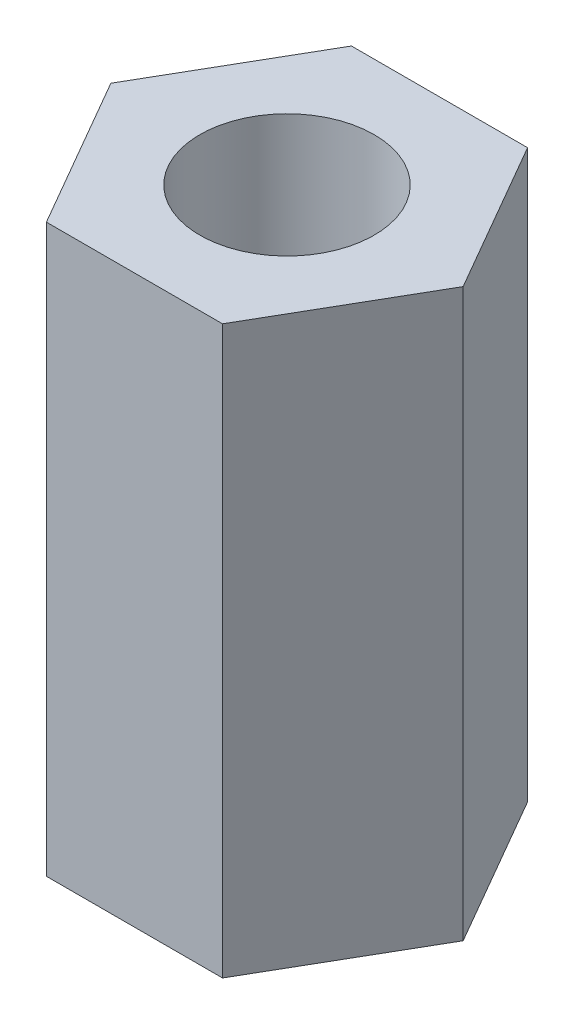
ISO-10303-21;
HEADER;
FILE_DESCRIPTION(('STEP AP214'),'2;1');
FILE_NAME('part.step','',(''),(''),'','','');
FILE_SCHEMA(('AUTOMOTIVE_DESIGN { 1 0 10303 214 1 1 1 1 }'));
ENDSEC;
DATA;
#1=APPLICATION_CONTEXT('core data for automotive mechanical design processes');
#2=APPLICATION_PROTOCOL_DEFINITION('international standard','automotive_design',2000,#1);
#3=PRODUCT_CONTEXT('',#1,'mechanical');
#4=PRODUCT('Part','Part','',(#3));
#5=PRODUCT_RELATED_PRODUCT_CATEGORY('part','',(#4));
#6=PRODUCT_DEFINITION_FORMATION('','',#4);
#7=PRODUCT_DEFINITION_CONTEXT('part definition',#1,'design');
#8=PRODUCT_DEFINITION('design','',#6,#7);
#9=PRODUCT_DEFINITION_SHAPE('','',#8);
#10=(LENGTH_UNIT() NAMED_UNIT(*) SI_UNIT(.MILLI.,.METRE.));
#11=(NAMED_UNIT(*) PLANE_ANGLE_UNIT() SI_UNIT($,.RADIAN.));
#12=(NAMED_UNIT(*) SI_UNIT($,.STERADIAN.) SOLID_ANGLE_UNIT());
#13=UNCERTAINTY_MEASURE_WITH_UNIT(LENGTH_MEASURE(1.E-05),#10,'distance_accuracy_value','');
#14=(GEOMETRIC_REPRESENTATION_CONTEXT(3) GLOBAL_UNCERTAINTY_ASSIGNED_CONTEXT((#13)) GLOBAL_UNIT_ASSIGNED_CONTEXT((#10,
#11,#12)) REPRESENTATION_CONTEXT('',''));
#15=CARTESIAN_POINT('',(0.,0.,0.));
#16=DIRECTION('',(0.,0.,1.));
#17=DIRECTION('',(1.,0.,0.));
#18=AXIS2_PLACEMENT_3D('',#15,#16,#17);
#19=CARTESIAN_POINT('',(0.,13.,0.));
#20=DIRECTION('',(0.,1.,0.));
#21=DIRECTION('',(0.,0.,1.));
#22=AXIS2_PLACEMENT_3D('',#19,#20,#21);
#23=PLANE('',#22);
#24=DIRECTION('',(-0.5,0.,-0.866025403784438));
#25=VECTOR('',#24,1.);
#26=CARTESIAN_POINT('',(4.04145188432738,13.,0.));
#27=LINE('',#26,#25);
#28=CARTESIAN_POINT('',(4.04145188432738,13.,0.));
#29=VERTEX_POINT('',#28);
#30=CARTESIAN_POINT('',(2.02072594216369,13.,-3.5));
#31=VERTEX_POINT('',#30);
#32=EDGE_CURVE('E139',#29,#31,#27,.T.);
#33=ORIENTED_EDGE('',*,*,#32,.T.);
#34=DIRECTION('',(-1.,0.,0.));
#35=VECTOR('',#34,1.);
#36=CARTESIAN_POINT('',(2.02072594216369,13.,-3.5));
#37=LINE('',#36,#35);
#38=CARTESIAN_POINT('',(-2.02072594216369,13.,-3.5));
#39=VERTEX_POINT('',#38);
#40=EDGE_CURVE('E97',#31,#39,#37,.T.);
#41=ORIENTED_EDGE('',*,*,#40,.T.);
#42=DIRECTION('',(-0.5,0.,0.866025403784439));
#43=VECTOR('',#42,1.);
#44=CARTESIAN_POINT('',(-2.02072594216369,13.,-3.5));
#45=LINE('',#44,#43);
#46=CARTESIAN_POINT('',(-4.04145188432738,13.,0.));
#47=VERTEX_POINT('',#46);
#48=EDGE_CURVE('E110',#39,#47,#45,.T.);
#49=ORIENTED_EDGE('',*,*,#48,.T.);
#50=DIRECTION('',(0.5,0.,0.866025403784438));
#51=VECTOR('',#50,1.);
#52=CARTESIAN_POINT('',(-4.04145188432738,13.,0.));
#53=LINE('',#52,#51);
#54=CARTESIAN_POINT('',(-2.02072594216369,13.,3.5));
#55=VERTEX_POINT('',#54);
#56=EDGE_CURVE('E104',#47,#55,#53,.T.);
#57=ORIENTED_EDGE('',*,*,#56,.T.);
#58=DIRECTION('',(1.,0.,0.));
#59=VECTOR('',#58,1.);
#60=CARTESIAN_POINT('',(-2.02072594216369,13.,3.5));
#61=LINE('',#60,#59);
#62=CARTESIAN_POINT('',(2.02072594216369,13.,3.5));
#63=VERTEX_POINT('',#62);
#64=EDGE_CURVE('E108',#55,#63,#61,.T.);
#65=ORIENTED_EDGE('',*,*,#64,.T.);
#66=DIRECTION('',(0.5,0.,-0.866025403784439));
#67=VECTOR('',#66,1.);
#68=CARTESIAN_POINT('',(2.02072594216369,13.,3.5));
#69=LINE('',#68,#67);
#70=EDGE_CURVE('E60',#63,#29,#69,.T.);
#71=ORIENTED_EDGE('',*,*,#70,.T.);
#72=EDGE_LOOP('',(#33,#41,#49,#57,#65,#71));
#73=FACE_BOUND('',#72,.T.);
#74=CARTESIAN_POINT('',(0.,13.,0.));
#75=DIRECTION('',(0.,1.,0.));
#76=DIRECTION('',(0.,0.,1.));
#77=AXIS2_PLACEMENT_3D('',#74,#75,#76);
#78=CIRCLE('',#77,2.);
#79=CARTESIAN_POINT('',(0.,13.,-2.));
#80=VERTEX_POINT('',#79);
#81=EDGE_CURVE('E132',#80,#80,#78,.T.);
#82=ORIENTED_EDGE('',*,*,#81,.F.);
#83=EDGE_LOOP('',(#82));
#84=FACE_BOUND('',#83,.T.);
#85=ADVANCED_FACE('F43',(#73,#84),#23,.T.);
#86=CARTESIAN_POINT('',(0.,0.,0.));
#87=DIRECTION('',(0.,1.,0.));
#88=DIRECTION('',(0.,0.,1.));
#89=AXIS2_PLACEMENT_3D('',#86,#87,#88);
#90=PLANE('',#89);
#91=DIRECTION('',(-0.5,0.,-0.866025403784438));
#92=VECTOR('',#91,1.);
#93=CARTESIAN_POINT('',(4.04145188432738,0.,0.));
#94=LINE('',#93,#92);
#95=CARTESIAN_POINT('',(4.04145188432738,0.,0.));
#96=VERTEX_POINT('',#95);
#97=CARTESIAN_POINT('',(2.02072594216369,0.,-3.5));
#98=VERTEX_POINT('',#97);
#99=EDGE_CURVE('E128',#96,#98,#94,.T.);
#100=ORIENTED_EDGE('',*,*,#99,.F.);
#101=DIRECTION('',(0.5,0.,-0.866025403784439));
#102=VECTOR('',#101,1.);
#103=CARTESIAN_POINT('',(2.02072594216369,0.,3.5));
#104=LINE('',#103,#102);
#105=CARTESIAN_POINT('',(2.02072594216369,0.,3.5));
#106=VERTEX_POINT('',#105);
#107=EDGE_CURVE('E89',#106,#96,#104,.T.);
#108=ORIENTED_EDGE('',*,*,#107,.F.);
#109=DIRECTION('',(1.,0.,0.));
#110=VECTOR('',#109,1.);
#111=CARTESIAN_POINT('',(-2.02072594216369,0.,3.5));
#112=LINE('',#111,#110);
#113=CARTESIAN_POINT('',(-2.02072594216369,0.,3.5));
#114=VERTEX_POINT('',#113);
#115=EDGE_CURVE('E83',#114,#106,#112,.T.);
#116=ORIENTED_EDGE('',*,*,#115,.F.);
#117=DIRECTION('',(0.5,0.,0.866025403784438));
#118=VECTOR('',#117,1.);
#119=CARTESIAN_POINT('',(-4.04145188432738,0.,0.));
#120=LINE('',#119,#118);
#121=CARTESIAN_POINT('',(-4.04145188432738,0.,0.));
#122=VERTEX_POINT('',#121);
#123=EDGE_CURVE('E118',#122,#114,#120,.T.);
#124=ORIENTED_EDGE('',*,*,#123,.F.);
#125=DIRECTION('',(-0.5,0.,0.866025403784439));
#126=VECTOR('',#125,1.);
#127=CARTESIAN_POINT('',(-2.02072594216369,0.,-3.5));
#128=LINE('',#127,#126);
#129=CARTESIAN_POINT('',(-2.02072594216369,0.,-3.5));
#130=VERTEX_POINT('',#129);
#131=EDGE_CURVE('E134',#130,#122,#128,.T.);
#132=ORIENTED_EDGE('',*,*,#131,.F.);
#133=DIRECTION('',(-1.,0.,0.));
#134=VECTOR('',#133,1.);
#135=CARTESIAN_POINT('',(2.02072594216369,0.,-3.5));
#136=LINE('',#135,#134);
#137=EDGE_CURVE('E131',#98,#130,#136,.T.);
#138=ORIENTED_EDGE('',*,*,#137,.F.);
#139=EDGE_LOOP('',(#100,#108,#116,#124,#132,#138));
#140=FACE_BOUND('',#139,.T.);
#141=CARTESIAN_POINT('',(0.,0.,0.));
#142=DIRECTION('',(0.,1.,0.));
#143=DIRECTION('',(0.,0.,1.));
#144=AXIS2_PLACEMENT_3D('',#141,#142,#143);
#145=CIRCLE('',#144,2.);
#146=CARTESIAN_POINT('',(0.,0.,-2.));
#147=VERTEX_POINT('',#146);
#148=EDGE_CURVE('E248',#147,#147,#145,.T.);
#149=ORIENTED_EDGE('',*,*,#148,.T.);
#150=EDGE_LOOP('',(#149));
#151=FACE_BOUND('',#150,.T.);
#152=ADVANCED_FACE('F148',(#140,#151),#90,.F.);
#153=CARTESIAN_POINT('',(4.04145188432738,13.,0.));
#154=DIRECTION('',(-0.866025403784439,0.,0.5));
#155=DIRECTION('',(0.5,0.,0.866025403784439));
#156=AXIS2_PLACEMENT_3D('',#153,#154,#155);
#157=PLANE('',#156);
#158=ORIENTED_EDGE('',*,*,#99,.T.);
#159=DIRECTION('',(0.,-1.,0.));
#160=VECTOR('',#159,1.);
#161=CARTESIAN_POINT('',(2.02072594216369,13.,-3.5));
#162=LINE('',#161,#160);
#163=EDGE_CURVE('E11',#31,#98,#162,.T.);
#164=ORIENTED_EDGE('',*,*,#163,.F.);
#165=ORIENTED_EDGE('',*,*,#32,.F.);
#166=DIRECTION('',(0.,-1.,0.));
#167=VECTOR('',#166,1.);
#168=CARTESIAN_POINT('',(4.04145188432738,13.,0.));
#169=LINE('',#168,#167);
#170=EDGE_CURVE('E124',#29,#96,#169,.T.);
#171=ORIENTED_EDGE('',*,*,#170,.T.);
#172=EDGE_LOOP('',(#158,#164,#165,#171));
#173=FACE_BOUND('',#172,.T.);
#174=ADVANCED_FACE('F45',(#173),#157,.F.);
#175=CARTESIAN_POINT('',(2.02072594216369,13.,-3.5));
#176=DIRECTION('',(0.,0.,1.));
#177=DIRECTION('',(1.,0.,0.));
#178=AXIS2_PLACEMENT_3D('',#175,#176,#177);
#179=PLANE('',#178);
#180=ORIENTED_EDGE('',*,*,#137,.T.);
#181=DIRECTION('',(0.,-1.,0.));
#182=VECTOR('',#181,1.);
#183=CARTESIAN_POINT('',(-2.02072594216369,13.,-3.5));
#184=LINE('',#183,#182);
#185=EDGE_CURVE('E52',#39,#130,#184,.T.);
#186=ORIENTED_EDGE('',*,*,#185,.F.);
#187=ORIENTED_EDGE('',*,*,#40,.F.);
#188=ORIENTED_EDGE('',*,*,#163,.T.);
#189=EDGE_LOOP('',(#180,#186,#187,#188));
#190=FACE_BOUND('',#189,.T.);
#191=ADVANCED_FACE('F174',(#190),#179,.F.);
#192=CARTESIAN_POINT('',(-2.02072594216369,13.,-3.5));
#193=DIRECTION('',(0.866025403784439,0.,0.5));
#194=DIRECTION('',(0.5,0.,-0.866025403784439));
#195=AXIS2_PLACEMENT_3D('',#192,#193,#194);
#196=PLANE('',#195);
#197=ORIENTED_EDGE('',*,*,#131,.T.);
#198=DIRECTION('',(0.,-1.,0.));
#199=VECTOR('',#198,1.);
#200=CARTESIAN_POINT('',(-4.04145188432738,13.,0.));
#201=LINE('',#200,#199);
#202=EDGE_CURVE('E119',#47,#122,#201,.T.);
#203=ORIENTED_EDGE('',*,*,#202,.F.);
#204=ORIENTED_EDGE('',*,*,#48,.F.);
#205=ORIENTED_EDGE('',*,*,#185,.T.);
#206=EDGE_LOOP('',(#197,#203,#204,#205));
#207=FACE_BOUND('',#206,.T.);
#208=ADVANCED_FACE('F145',(#207),#196,.F.);
#209=CARTESIAN_POINT('',(-4.04145188432738,13.,0.));
#210=DIRECTION('',(0.866025403784438,0.,-0.5));
#211=DIRECTION('',(-0.5,0.,-0.866025403784438));
#212=AXIS2_PLACEMENT_3D('',#209,#210,#211);
#213=PLANE('',#212);
#214=ORIENTED_EDGE('',*,*,#123,.T.);
#215=DIRECTION('',(0.,-1.,0.));
#216=VECTOR('',#215,1.);
#217=CARTESIAN_POINT('',(-2.02072594216369,13.,3.5));
#218=LINE('',#217,#216);
#219=EDGE_CURVE('E115',#55,#114,#218,.T.);
#220=ORIENTED_EDGE('',*,*,#219,.F.);
#221=ORIENTED_EDGE('',*,*,#56,.F.);
#222=ORIENTED_EDGE('',*,*,#202,.T.);
#223=EDGE_LOOP('',(#214,#220,#221,#222));
#224=FACE_BOUND('',#223,.T.);
#225=ADVANCED_FACE('F116',(#224),#213,.F.);
#226=CARTESIAN_POINT('',(-2.02072594216369,13.,3.5));
#227=DIRECTION('',(0.,0.,-1.));
#228=DIRECTION('',(-1.,0.,0.));
#229=AXIS2_PLACEMENT_3D('',#226,#227,#228);
#230=PLANE('',#229);
#231=ORIENTED_EDGE('',*,*,#115,.T.);
#232=DIRECTION('',(0.,-1.,0.));
#233=VECTOR('',#232,1.);
#234=CARTESIAN_POINT('',(2.02072594216369,13.,3.5));
#235=LINE('',#234,#233);
#236=EDGE_CURVE('E120',#63,#106,#235,.T.);
#237=ORIENTED_EDGE('',*,*,#236,.F.);
#238=ORIENTED_EDGE('',*,*,#64,.F.);
#239=ORIENTED_EDGE('',*,*,#219,.T.);
#240=EDGE_LOOP('',(#231,#237,#238,#239));
#241=FACE_BOUND('',#240,.T.);
#242=ADVANCED_FACE('F122',(#241),#230,.F.);
#243=CARTESIAN_POINT('',(2.02072594216369,13.,3.5));
#244=DIRECTION('',(-0.866025403784439,0.,-0.5));
#245=DIRECTION('',(-0.5,0.,0.866025403784439));
#246=AXIS2_PLACEMENT_3D('',#243,#244,#245);
#247=PLANE('',#246);
#248=ORIENTED_EDGE('',*,*,#107,.T.);
#249=ORIENTED_EDGE('',*,*,#170,.F.);
#250=ORIENTED_EDGE('',*,*,#70,.F.);
#251=ORIENTED_EDGE('',*,*,#236,.T.);
#252=EDGE_LOOP('',(#248,#249,#250,#251));
#253=FACE_BOUND('',#252,.T.);
#254=ADVANCED_FACE('F153',(#253),#247,.F.);
#255=CARTESIAN_POINT('',(0.,13.,0.));
#256=DIRECTION('',(0.,-1.,0.));
#257=DIRECTION('',(0.,0.,-1.));
#258=AXIS2_PLACEMENT_3D('',#255,#256,#257);
#259=CYLINDRICAL_SURFACE('',#258,2.);
#260=CARTESIAN_POINT('',(0.,13.,-2.));
#261=CARTESIAN_POINT('',(0.,12.8645833333333,-2.));
#262=CARTESIAN_POINT('',(0.,12.7291666666667,-2.));
#263=CARTESIAN_POINT('',(0.,12.4583333333333,-2.));
#264=CARTESIAN_POINT('',(0.,12.3229166666667,-2.));
#265=CARTESIAN_POINT('',(0.,12.0520833333333,-2.));
#266=CARTESIAN_POINT('',(0.,11.9166666666667,-2.));
#267=CARTESIAN_POINT('',(0.,11.6458333333333,-2.));
#268=CARTESIAN_POINT('',(0.,11.5104166666667,-2.));
#269=CARTESIAN_POINT('',(0.,11.2395833333333,-2.));
#270=CARTESIAN_POINT('',(0.,11.1041666666667,-2.));
#271=CARTESIAN_POINT('',(0.,10.8333333333333,-2.));
#272=CARTESIAN_POINT('',(0.,10.6979166666667,-2.));
#273=CARTESIAN_POINT('',(0.,10.4270833333333,-2.));
#274=CARTESIAN_POINT('',(0.,10.2916666666667,-2.));
#275=CARTESIAN_POINT('',(0.,10.0208333333333,-2.));
#276=CARTESIAN_POINT('',(0.,9.88541666666667,-2.));
#277=CARTESIAN_POINT('',(0.,9.61458333333333,-2.));
#278=CARTESIAN_POINT('',(0.,9.47916666666667,-2.));
#279=CARTESIAN_POINT('',(0.,9.20833333333333,-2.));
#280=CARTESIAN_POINT('',(0.,9.07291666666666,-2.));
#281=CARTESIAN_POINT('',(0.,8.80208333333333,-2.));
#282=CARTESIAN_POINT('',(0.,8.66666666666667,-2.));
#283=CARTESIAN_POINT('',(0.,8.39583333333333,-2.));
#284=CARTESIAN_POINT('',(0.,8.26041666666667,-2.));
#285=CARTESIAN_POINT('',(0.,7.98958333333333,-2.));
#286=CARTESIAN_POINT('',(0.,7.85416666666667,-2.));
#287=CARTESIAN_POINT('',(0.,7.58333333333333,-2.));
#288=CARTESIAN_POINT('',(0.,7.44791666666667,-2.));
#289=CARTESIAN_POINT('',(0.,7.17708333333333,-2.));
#290=CARTESIAN_POINT('',(0.,7.04166666666667,-2.));
#291=CARTESIAN_POINT('',(0.,6.77083333333333,-2.));
#292=CARTESIAN_POINT('',(0.,6.63541666666667,-2.));
#293=CARTESIAN_POINT('',(0.,6.36458333333333,-2.));
#294=CARTESIAN_POINT('',(0.,6.22916666666667,-2.));
#295=CARTESIAN_POINT('',(0.,5.95833333333333,-2.));
#296=CARTESIAN_POINT('',(0.,5.82291666666667,-2.));
#297=CARTESIAN_POINT('',(0.,5.55208333333333,-2.));
#298=CARTESIAN_POINT('',(0.,5.41666666666667,-2.));
#299=CARTESIAN_POINT('',(0.,5.14583333333333,-2.));
#300=CARTESIAN_POINT('',(0.,5.01041666666667,-2.));
#301=CARTESIAN_POINT('',(0.,4.73958333333333,-2.));
#302=CARTESIAN_POINT('',(0.,4.60416666666667,-2.));
#303=CARTESIAN_POINT('',(0.,4.33333333333333,-2.));
#304=CARTESIAN_POINT('',(0.,4.19791666666667,-2.));
#305=CARTESIAN_POINT('',(0.,3.92708333333333,-2.));
#306=CARTESIAN_POINT('',(0.,3.79166666666667,-2.));
#307=CARTESIAN_POINT('',(0.,3.52083333333333,-2.));
#308=CARTESIAN_POINT('',(0.,3.38541666666667,-2.));
#309=CARTESIAN_POINT('',(0.,3.11458333333333,-2.));
#310=CARTESIAN_POINT('',(0.,2.97916666666667,-2.));
#311=CARTESIAN_POINT('',(0.,2.70833333333333,-2.));
#312=CARTESIAN_POINT('',(0.,2.57291666666667,-2.));
#313=CARTESIAN_POINT('',(0.,2.30208333333333,-2.));
#314=CARTESIAN_POINT('',(0.,2.16666666666667,-2.));
#315=CARTESIAN_POINT('',(0.,1.89583333333333,-2.));
#316=CARTESIAN_POINT('',(0.,1.76041666666667,-2.));
#317=CARTESIAN_POINT('',(0.,1.48958333333333,-2.));
#318=CARTESIAN_POINT('',(0.,1.35416666666667,-2.));
#319=CARTESIAN_POINT('',(0.,1.08333333333333,-2.));
#320=CARTESIAN_POINT('',(0.,0.947916666666667,-2.));
#321=CARTESIAN_POINT('',(0.,0.677083333333334,-2.));
#322=CARTESIAN_POINT('',(0.,0.541666666666667,-2.));
#323=CARTESIAN_POINT('',(0.,0.270833333333334,-2.));
#324=CARTESIAN_POINT('',(0.,0.135416666666667,-2.));
#325=CARTESIAN_POINT('',(0.,0.,-2.));
#326=B_SPLINE_CURVE_WITH_KNOTS('',3,(#260,#261,#262,#263,#264,#265,#266,#267,#268,#269,#270,
#271,#272,#273,#274,#275,#276,#277,#278,#279,#280,#281,#282,#283,#284,#285,#286,#287,#288,#289,
#290,#291,#292,#293,#294,#295,#296,#297,#298,#299,#300,#301,#302,#303,#304,#305,#306,#307,#308,
#309,#310,#311,#312,#313,#314,#315,#316,#317,#318,#319,#320,#321,#322,#323,#324,#325),
.UNSPECIFIED.,.F.,.F.,(4,2,2,2,2,2,2,2,2,2,2,2,2,2,2,2,2,2,2,2,2,2,2,2,2,2,2,2,2,2,2,2,4),(0.,
0.40625,0.812500000000001,1.21875,1.625,2.03125,2.4375,2.84375,3.25,3.65625,4.0625,4.46875,
4.875,5.28125,5.6875,6.09375,6.5,6.90625,7.3125,7.71875,8.125,8.53125,8.9375,9.34375,9.75,
10.15625,10.5625,10.96875,11.375,11.78125,12.1875,12.59375,13.),.UNSPECIFIED.);
#327=EDGE_CURVE('BSEAM155',#80,#147,#326,.T.);
#328=ORIENTED_EDGE('',*,*,#81,.T.);
#329=ORIENTED_EDGE('',*,*,#148,.F.);
#330=ORIENTED_EDGE('',*,*,#327,.T.);
#331=ORIENTED_EDGE('',*,*,#327,.F.);
#332=EDGE_LOOP('',(#328,#330,#329,#331));
#333=FACE_BOUND('',#332,.T.);
#334=ADVANCED_FACE('F155',(#333),#259,.F.);
#335=CLOSED_SHELL('',(#85,#152,#174,#191,#208,#225,#242,#254,#334));
#336=MANIFOLD_SOLID_BREP('B2',#335);
#337=ADVANCED_BREP_SHAPE_REPRESENTATION('',(#18,#336),#14);
#338=SHAPE_DEFINITION_REPRESENTATION(#9,#337);
ENDSEC;
END-ISO-10303-21;
